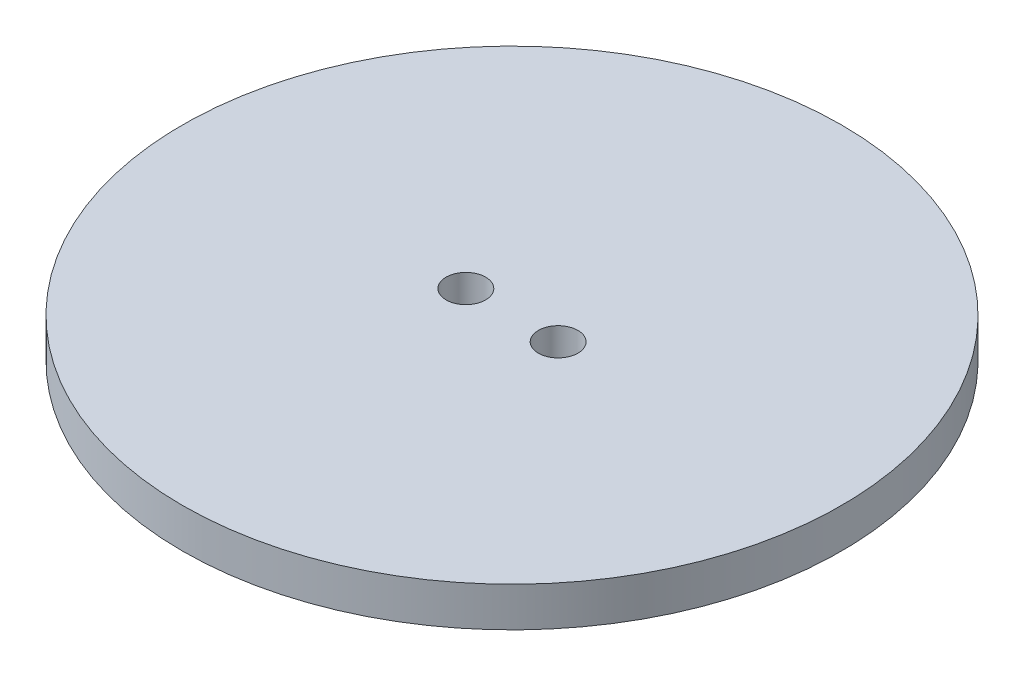
ISO-10303-21;
HEADER;
FILE_DESCRIPTION(('STEP AP214'),'2;1');
FILE_NAME('part.step','',(''),(''),'','','');
FILE_SCHEMA(('AUTOMOTIVE_DESIGN { 1 0 10303 214 1 1 1 1 }'));
ENDSEC;
DATA;
#1=APPLICATION_CONTEXT('core data for automotive mechanical design processes');
#2=APPLICATION_PROTOCOL_DEFINITION('international standard','automotive_design',2000,#1);
#3=PRODUCT_CONTEXT('',#1,'mechanical');
#4=PRODUCT('Part','Part','',(#3));
#5=PRODUCT_RELATED_PRODUCT_CATEGORY('part','',(#4));
#6=PRODUCT_DEFINITION_FORMATION('','',#4);
#7=PRODUCT_DEFINITION_CONTEXT('part definition',#1,'design');
#8=PRODUCT_DEFINITION('design','',#6,#7);
#9=PRODUCT_DEFINITION_SHAPE('','',#8);
#10=(LENGTH_UNIT() NAMED_UNIT(*) SI_UNIT(.MILLI.,.METRE.));
#11=(NAMED_UNIT(*) PLANE_ANGLE_UNIT() SI_UNIT($,.RADIAN.));
#12=(NAMED_UNIT(*) SI_UNIT($,.STERADIAN.) SOLID_ANGLE_UNIT());
#13=UNCERTAINTY_MEASURE_WITH_UNIT(LENGTH_MEASURE(1.E-05),#10,'distance_accuracy_value','');
#14=(GEOMETRIC_REPRESENTATION_CONTEXT(3) GLOBAL_UNCERTAINTY_ASSIGNED_CONTEXT((#13)) GLOBAL_UNIT_ASSIGNED_CONTEXT((#10,
#11,#12)) REPRESENTATION_CONTEXT('',''));
#15=CARTESIAN_POINT('',(0.,0.,0.));
#16=DIRECTION('',(0.,0.,1.));
#17=DIRECTION('',(1.,0.,0.));
#18=AXIS2_PLACEMENT_3D('',#15,#16,#17);
#19=CARTESIAN_POINT('',(0.,3.,0.));
#20=DIRECTION('',(0.,1.,0.));
#21=DIRECTION('',(0.,0.,1.));
#22=AXIS2_PLACEMENT_3D('',#19,#20,#21);
#23=PLANE('',#22);
#24=CARTESIAN_POINT('',(-3.5,3.,0.));
#25=DIRECTION('',(0.,1.,0.));
#26=DIRECTION('',(0.,0.,1.));
#27=AXIS2_PLACEMENT_3D('',#24,#25,#26);
#28=CIRCLE('',#27,1.5);
#29=CARTESIAN_POINT('',(-3.5,3.,1.5));
#30=VERTEX_POINT('',#29);
#31=EDGE_CURVE('E42',#30,#30,#28,.T.);
#32=ORIENTED_EDGE('',*,*,#31,.F.);
#33=EDGE_LOOP('',(#32));
#34=FACE_BOUND('',#33,.T.);
#35=CARTESIAN_POINT('',(0.,3.,0.));
#36=DIRECTION('',(0.,1.,0.));
#37=DIRECTION('',(0.,0.,1.));
#38=AXIS2_PLACEMENT_3D('',#35,#36,#37);
#39=CIRCLE('',#38,25.);
#40=CARTESIAN_POINT('',(0.,3.,25.));
#41=VERTEX_POINT('',#40);
#42=EDGE_CURVE('E10',#41,#41,#39,.T.);
#43=ORIENTED_EDGE('',*,*,#42,.T.);
#44=EDGE_LOOP('',(#43));
#45=FACE_BOUND('',#44,.T.);
#46=CARTESIAN_POINT('',(3.5,3.,0.));
#47=DIRECTION('',(0.,1.,0.));
#48=DIRECTION('',(0.,0.,1.));
#49=AXIS2_PLACEMENT_3D('',#46,#47,#48);
#50=CIRCLE('',#49,1.5);
#51=CARTESIAN_POINT('',(3.5,3.,1.5));
#52=VERTEX_POINT('',#51);
#53=EDGE_CURVE('E47',#52,#52,#50,.T.);
#54=ORIENTED_EDGE('',*,*,#53,.F.);
#55=EDGE_LOOP('',(#54));
#56=FACE_BOUND('',#55,.T.);
#57=ADVANCED_FACE('F31',(#34,#45,#56),#23,.T.);
#58=CARTESIAN_POINT('',(0.,0.,0.));
#59=DIRECTION('',(0.,1.,0.));
#60=DIRECTION('',(0.,0.,1.));
#61=AXIS2_PLACEMENT_3D('',#58,#59,#60);
#62=PLANE('',#61);
#63=CARTESIAN_POINT('',(0.,0.,0.));
#64=DIRECTION('',(0.,1.,0.));
#65=DIRECTION('',(0.,0.,1.));
#66=AXIS2_PLACEMENT_3D('',#63,#64,#65);
#67=CIRCLE('',#66,25.);
#68=CARTESIAN_POINT('',(0.,0.,25.));
#69=VERTEX_POINT('',#68);
#70=EDGE_CURVE('E35',#69,#69,#67,.T.);
#71=ORIENTED_EDGE('',*,*,#70,.F.);
#72=EDGE_LOOP('',(#71));
#73=FACE_BOUND('',#72,.T.);
#74=CARTESIAN_POINT('',(-3.5,0.,0.));
#75=DIRECTION('',(0.,1.,0.));
#76=DIRECTION('',(0.,0.,1.));
#77=AXIS2_PLACEMENT_3D('',#74,#75,#76);
#78=CIRCLE('',#77,1.5);
#79=CARTESIAN_POINT('',(-3.5,0.,1.5));
#80=VERTEX_POINT('',#79);
#81=EDGE_CURVE('E44',#80,#80,#78,.T.);
#82=ORIENTED_EDGE('',*,*,#81,.T.);
#83=EDGE_LOOP('',(#82));
#84=FACE_BOUND('',#83,.T.);
#85=CARTESIAN_POINT('',(3.5,0.,0.));
#86=DIRECTION('',(0.,1.,0.));
#87=DIRECTION('',(0.,0.,1.));
#88=AXIS2_PLACEMENT_3D('',#85,#86,#87);
#89=CIRCLE('',#88,1.5);
#90=CARTESIAN_POINT('',(3.5,0.,1.5));
#91=VERTEX_POINT('',#90);
#92=EDGE_CURVE('E50',#91,#91,#89,.T.);
#93=ORIENTED_EDGE('',*,*,#92,.T.);
#94=EDGE_LOOP('',(#93));
#95=FACE_BOUND('',#94,.T.);
#96=ADVANCED_FACE('F60',(#73,#84,#95),#62,.F.);
#97=CARTESIAN_POINT('',(0.,3.,0.));
#98=DIRECTION('',(0.,-1.,0.));
#99=DIRECTION('',(0.,0.,-1.));
#100=AXIS2_PLACEMENT_3D('',#97,#98,#99);
#101=CYLINDRICAL_SURFACE('',#100,25.);
#102=ORIENTED_EDGE('',*,*,#42,.F.);
#103=EDGE_LOOP('',(#102));
#104=FACE_BOUND('',#103,.T.);
#105=ORIENTED_EDGE('',*,*,#70,.T.);
#106=EDGE_LOOP('',(#105));
#107=FACE_BOUND('',#106,.T.);
#108=ADVANCED_FACE('F33',(#104,#107),#101,.T.);
#109=CARTESIAN_POINT('',(-3.5,3.,0.));
#110=DIRECTION('',(0.,-1.,0.));
#111=DIRECTION('',(0.,0.,-1.));
#112=AXIS2_PLACEMENT_3D('',#109,#110,#111);
#113=CYLINDRICAL_SURFACE('',#112,1.5);
#114=ORIENTED_EDGE('',*,*,#31,.T.);
#115=EDGE_LOOP('',(#114));
#116=FACE_BOUND('',#115,.T.);
#117=ORIENTED_EDGE('',*,*,#81,.F.);
#118=EDGE_LOOP('',(#117));
#119=FACE_BOUND('',#118,.T.);
#120=ADVANCED_FACE('F69',(#116,#119),#113,.F.);
#121=CARTESIAN_POINT('',(3.5,3.,0.));
#122=DIRECTION('',(0.,-1.,0.));
#123=DIRECTION('',(0.,0.,-1.));
#124=AXIS2_PLACEMENT_3D('',#121,#122,#123);
#125=CYLINDRICAL_SURFACE('',#124,1.5);
#126=ORIENTED_EDGE('',*,*,#53,.T.);
#127=EDGE_LOOP('',(#126));
#128=FACE_BOUND('',#127,.T.);
#129=ORIENTED_EDGE('',*,*,#92,.F.);
#130=EDGE_LOOP('',(#129));
#131=FACE_BOUND('',#130,.T.);
#132=ADVANCED_FACE('F56',(#128,#131),#125,.F.);
#133=CLOSED_SHELL('',(#57,#96,#108,#120,#132));
#134=MANIFOLD_SOLID_BREP('B2',#133);
#135=ADVANCED_BREP_SHAPE_REPRESENTATION('',(#18,#134),#14);
#136=SHAPE_DEFINITION_REPRESENTATION(#9,#135);
ENDSEC;
END-ISO-10303-21;
